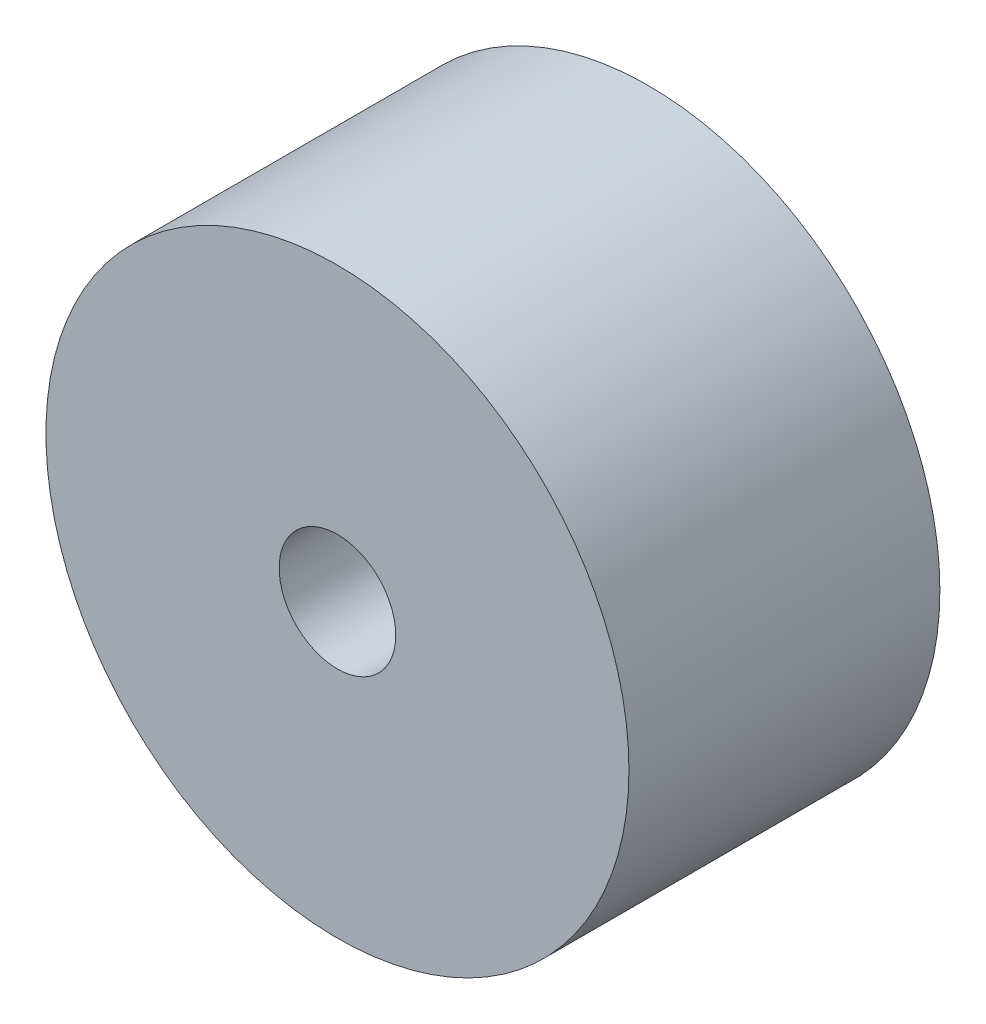
ISO-10303-21;
HEADER;
FILE_DESCRIPTION(('STEP AP214'),'2;1');
FILE_NAME('part.step','',(''),(''),'','','');
FILE_SCHEMA(('AUTOMOTIVE_DESIGN { 1 0 10303 214 1 1 1 1 }'));
ENDSEC;
DATA;
#1=APPLICATION_CONTEXT('core data for automotive mechanical design processes');
#2=APPLICATION_PROTOCOL_DEFINITION('international standard','automotive_design',2000,#1);
#3=PRODUCT_CONTEXT('',#1,'mechanical');
#4=PRODUCT('Part','Part','',(#3));
#5=PRODUCT_RELATED_PRODUCT_CATEGORY('part','',(#4));
#6=PRODUCT_DEFINITION_FORMATION('','',#4);
#7=PRODUCT_DEFINITION_CONTEXT('part definition',#1,'design');
#8=PRODUCT_DEFINITION('design','',#6,#7);
#9=PRODUCT_DEFINITION_SHAPE('','',#8);
#10=(LENGTH_UNIT() NAMED_UNIT(*) SI_UNIT(.MILLI.,.METRE.));
#11=(NAMED_UNIT(*) PLANE_ANGLE_UNIT() SI_UNIT($,.RADIAN.));
#12=(NAMED_UNIT(*) SI_UNIT($,.STERADIAN.) SOLID_ANGLE_UNIT());
#13=UNCERTAINTY_MEASURE_WITH_UNIT(LENGTH_MEASURE(1.E-05),#10,'distance_accuracy_value','');
#14=(GEOMETRIC_REPRESENTATION_CONTEXT(3) GLOBAL_UNCERTAINTY_ASSIGNED_CONTEXT((#13)) GLOBAL_UNIT_ASSIGNED_CONTEXT((#10,
#11,#12)) REPRESENTATION_CONTEXT('',''));
#15=CARTESIAN_POINT('',(0.,0.,0.));
#16=DIRECTION('',(0.,0.,1.));
#17=DIRECTION('',(1.,0.,0.));
#18=AXIS2_PLACEMENT_3D('',#15,#16,#17);
#19=CARTESIAN_POINT('',(-38.0825397427676,17.9320696847013,8.));
#20=DIRECTION('',(0.,0.,1.));
#21=DIRECTION('',(1.,0.,0.));
#22=AXIS2_PLACEMENT_3D('',#19,#20,#21);
#23=PLANE('',#22);
#24=CARTESIAN_POINT('',(-38.0825397427676,17.9320696847013,8.));
#25=DIRECTION('',(0.,0.,1.));
#26=DIRECTION('',(1.,0.,0.));
#27=AXIS2_PLACEMENT_3D('',#24,#25,#26);
#28=CIRCLE('',#27,7.5);
#29=CARTESIAN_POINT('',(-30.5825397427676,17.9320696847013,8.));
#30=VERTEX_POINT('',#29);
#31=EDGE_CURVE('E10',#30,#30,#28,.T.);
#32=ORIENTED_EDGE('',*,*,#31,.T.);
#33=EDGE_LOOP('',(#32));
#34=FACE_BOUND('',#33,.T.);
#35=CARTESIAN_POINT('',(-38.0825397427676,17.9320696847013,8.));
#36=DIRECTION('',(0.,0.,1.));
#37=DIRECTION('',(1.,0.,0.));
#38=AXIS2_PLACEMENT_3D('',#35,#36,#37);
#39=CIRCLE('',#38,1.5);
#40=CARTESIAN_POINT('',(-36.5825397427676,17.9320696847013,8.));
#41=VERTEX_POINT('',#40);
#42=EDGE_CURVE('E46',#41,#41,#39,.T.);
#43=ORIENTED_EDGE('',*,*,#42,.F.);
#44=EDGE_LOOP('',(#43));
#45=FACE_BOUND('',#44,.T.);
#46=ADVANCED_FACE('F35',(#34,#45),#23,.T.);
#47=CARTESIAN_POINT('',(-38.0825397427676,17.9320696847013,0.));
#48=DIRECTION('',(0.,0.,1.));
#49=DIRECTION('',(1.,0.,0.));
#50=AXIS2_PLACEMENT_3D('',#47,#48,#49);
#51=PLANE('',#50);
#52=CARTESIAN_POINT('',(-38.0825397427676,17.9320696847013,0.));
#53=DIRECTION('',(0.,0.,1.));
#54=DIRECTION('',(1.,0.,0.));
#55=AXIS2_PLACEMENT_3D('',#52,#53,#54);
#56=CIRCLE('',#55,7.5);
#57=CARTESIAN_POINT('',(-30.5825397427676,17.9320696847013,0.));
#58=VERTEX_POINT('',#57);
#59=EDGE_CURVE('E39',#58,#58,#56,.T.);
#60=ORIENTED_EDGE('',*,*,#59,.F.);
#61=EDGE_LOOP('',(#60));
#62=FACE_BOUND('',#61,.T.);
#63=CARTESIAN_POINT('',(-38.0825397427676,17.9320696847013,0.));
#64=DIRECTION('',(0.,0.,1.));
#65=DIRECTION('',(1.,0.,0.));
#66=AXIS2_PLACEMENT_3D('',#63,#64,#65);
#67=CIRCLE('',#66,1.5);
#68=CARTESIAN_POINT('',(-36.5825397427676,17.9320696847013,0.));
#69=VERTEX_POINT('',#68);
#70=EDGE_CURVE('E48',#69,#69,#67,.T.);
#71=ORIENTED_EDGE('',*,*,#70,.T.);
#72=EDGE_LOOP('',(#71));
#73=FACE_BOUND('',#72,.T.);
#74=ADVANCED_FACE('F58',(#62,#73),#51,.F.);
#75=CARTESIAN_POINT('',(-38.0825397427676,17.9320696847013,8.));
#76=DIRECTION('',(0.,0.,-1.));
#77=DIRECTION('',(-1.,0.,0.));
#78=AXIS2_PLACEMENT_3D('',#75,#76,#77);
#79=CYLINDRICAL_SURFACE('',#78,7.5);
#80=ORIENTED_EDGE('',*,*,#31,.F.);
#81=EDGE_LOOP('',(#80));
#82=FACE_BOUND('',#81,.T.);
#83=ORIENTED_EDGE('',*,*,#59,.T.);
#84=EDGE_LOOP('',(#83));
#85=FACE_BOUND('',#84,.T.);
#86=ADVANCED_FACE('F37',(#82,#85),#79,.T.);
#87=CARTESIAN_POINT('',(-38.0825397427676,17.9320696847013,8.));
#88=DIRECTION('',(0.,0.,-1.));
#89=DIRECTION('',(-1.,0.,0.));
#90=AXIS2_PLACEMENT_3D('',#87,#88,#89);
#91=CYLINDRICAL_SURFACE('',#90,1.5);
#92=ORIENTED_EDGE('',*,*,#42,.T.);
#93=EDGE_LOOP('',(#92));
#94=FACE_BOUND('',#93,.T.);
#95=ORIENTED_EDGE('',*,*,#70,.F.);
#96=EDGE_LOOP('',(#95));
#97=FACE_BOUND('',#96,.T.);
#98=ADVANCED_FACE('F54',(#94,#97),#91,.F.);
#99=CLOSED_SHELL('',(#46,#74,#86,#98));
#100=MANIFOLD_SOLID_BREP('B2',#99);
#101=ADVANCED_BREP_SHAPE_REPRESENTATION('',(#18,#100),#14);
#102=SHAPE_DEFINITION_REPRESENTATION(#9,#101);
ENDSEC;
END-ISO-10303-21;
